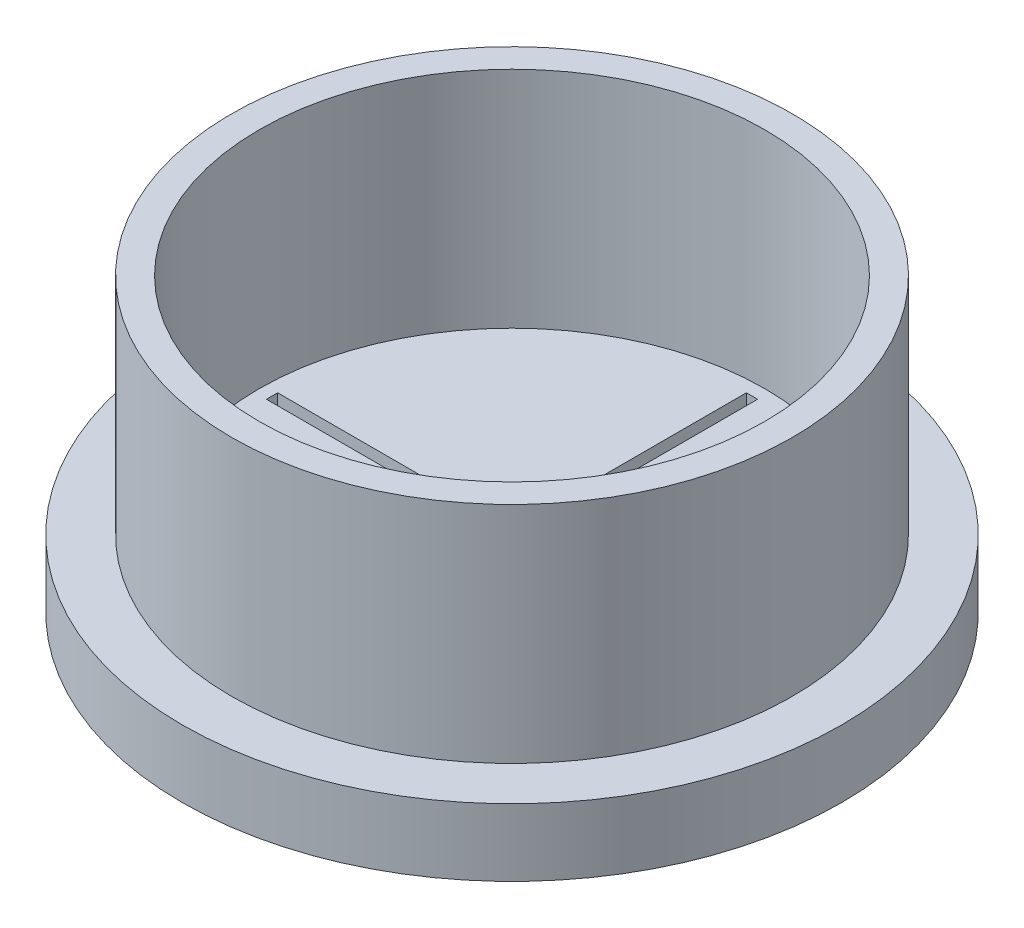
ISO-10303-21;
HEADER;
FILE_DESCRIPTION(('STEP AP214'),'2;1');
FILE_NAME('part.step','',(''),(''),'','','');
FILE_SCHEMA(('AUTOMOTIVE_DESIGN { 1 0 10303 214 1 1 1 1 }'));
ENDSEC;
DATA;
#1=APPLICATION_CONTEXT('core data for automotive mechanical design processes');
#2=APPLICATION_PROTOCOL_DEFINITION('international standard','automotive_design',2000,#1);
#3=PRODUCT_CONTEXT('',#1,'mechanical');
#4=PRODUCT('Part','Part','',(#3));
#5=PRODUCT_RELATED_PRODUCT_CATEGORY('part','',(#4));
#6=PRODUCT_DEFINITION_FORMATION('','',#4);
#7=PRODUCT_DEFINITION_CONTEXT('part definition',#1,'design');
#8=PRODUCT_DEFINITION('design','',#6,#7);
#9=PRODUCT_DEFINITION_SHAPE('','',#8);
#10=(LENGTH_UNIT() NAMED_UNIT(*) SI_UNIT(.MILLI.,.METRE.));
#11=(NAMED_UNIT(*) PLANE_ANGLE_UNIT() SI_UNIT($,.RADIAN.));
#12=(NAMED_UNIT(*) SI_UNIT($,.STERADIAN.) SOLID_ANGLE_UNIT());
#13=UNCERTAINTY_MEASURE_WITH_UNIT(LENGTH_MEASURE(1.E-05),#10,'distance_accuracy_value','');
#14=(GEOMETRIC_REPRESENTATION_CONTEXT(3) GLOBAL_UNCERTAINTY_ASSIGNED_CONTEXT((#13)) GLOBAL_UNIT_ASSIGNED_CONTEXT((#10,
#11,#12)) REPRESENTATION_CONTEXT('',''));
#15=CARTESIAN_POINT('',(0.,0.,0.));
#16=DIRECTION('',(0.,0.,1.));
#17=DIRECTION('',(1.,0.,0.));
#18=AXIS2_PLACEMENT_3D('',#15,#16,#17);
#19=CARTESIAN_POINT('',(-10.7,0.,-0.25));
#20=DIRECTION('',(0.,0.,1.));
#21=DIRECTION('',(1.,0.,0.));
#22=AXIS2_PLACEMENT_3D('',#19,#20,#21);
#23=PLANE('',#22);
#24=DIRECTION('',(0.,1.,0.));
#25=VECTOR('',#24,1.);
#26=CARTESIAN_POINT('',(0.25,0.,-0.25));
#27=LINE('',#26,#25);
#28=CARTESIAN_POINT('',(0.25,0.,-0.25));
#29=VERTEX_POINT('',#28);
#30=CARTESIAN_POINT('',(0.25,3.,-0.25));
#31=VERTEX_POINT('',#30);
#32=EDGE_CURVE('E142',#29,#31,#27,.T.);
#33=ORIENTED_EDGE('',*,*,#32,.F.);
#34=DIRECTION('',(1.,0.,0.));
#35=VECTOR('',#34,1.);
#36=CARTESIAN_POINT('',(-10.7,0.,-0.25));
#37=LINE('',#36,#35);
#38=CARTESIAN_POINT('',(10.7,0.,-0.25));
#39=VERTEX_POINT('',#38);
#40=EDGE_CURVE('E175',#29,#39,#37,.T.);
#41=ORIENTED_EDGE('',*,*,#40,.T.);
#42=DIRECTION('',(0.,1.,0.));
#43=VECTOR('',#42,1.);
#44=CARTESIAN_POINT('',(10.7,0.,-0.25));
#45=LINE('',#44,#43);
#46=CARTESIAN_POINT('',(10.7,3.,-0.25));
#47=VERTEX_POINT('',#46);
#48=EDGE_CURVE('E194',#39,#47,#45,.T.);
#49=ORIENTED_EDGE('',*,*,#48,.T.);
#50=DIRECTION('',(1.,0.,0.));
#51=VECTOR('',#50,1.);
#52=CARTESIAN_POINT('',(-10.7,3.,-0.25));
#53=LINE('',#52,#51);
#54=EDGE_CURVE('E188',#31,#47,#53,.T.);
#55=ORIENTED_EDGE('',*,*,#54,.F.);
#56=EDGE_LOOP('',(#33,#41,#49,#55));
#57=FACE_BOUND('',#56,.T.);
#58=ADVANCED_FACE('F33',(#57),#23,.T.);
#59=CARTESIAN_POINT('',(-10.7,0.,0.25));
#60=DIRECTION('',(0.,0.,1.));
#61=DIRECTION('',(1.,0.,0.));
#62=AXIS2_PLACEMENT_3D('',#59,#60,#61);
#63=PLANE('',#62);
#64=DIRECTION('',(1.,0.,0.));
#65=VECTOR('',#64,1.);
#66=CARTESIAN_POINT('',(-10.7,0.,0.25));
#67=LINE('',#66,#65);
#68=CARTESIAN_POINT('',(0.25,0.,0.25));
#69=VERTEX_POINT('',#68);
#70=CARTESIAN_POINT('',(10.7,0.,0.25));
#71=VERTEX_POINT('',#70);
#72=EDGE_CURVE('E56',#69,#71,#67,.T.);
#73=ORIENTED_EDGE('',*,*,#72,.F.);
#74=DIRECTION('',(0.,1.,0.));
#75=VECTOR('',#74,1.);
#76=CARTESIAN_POINT('',(0.25,0.,0.25));
#77=LINE('',#76,#75);
#78=CARTESIAN_POINT('',(0.250000000000002,3.,0.25));
#79=VERTEX_POINT('',#78);
#80=EDGE_CURVE('E11',#69,#79,#77,.T.);
#81=ORIENTED_EDGE('',*,*,#80,.T.);
#82=DIRECTION('',(1.,0.,0.));
#83=VECTOR('',#82,1.);
#84=CARTESIAN_POINT('',(-10.7,3.,0.25));
#85=LINE('',#84,#83);
#86=CARTESIAN_POINT('',(10.7,3.,0.25));
#87=VERTEX_POINT('',#86);
#88=EDGE_CURVE('E182',#79,#87,#85,.T.);
#89=ORIENTED_EDGE('',*,*,#88,.T.);
#90=DIRECTION('',(0.,1.,0.));
#91=VECTOR('',#90,1.);
#92=CARTESIAN_POINT('',(10.7,0.,0.25));
#93=LINE('',#92,#91);
#94=EDGE_CURVE('E197',#71,#87,#93,.T.);
#95=ORIENTED_EDGE('',*,*,#94,.F.);
#96=EDGE_LOOP('',(#73,#81,#89,#95));
#97=FACE_BOUND('',#96,.T.);
#98=ADVANCED_FACE('F245',(#97),#63,.F.);
#99=CARTESIAN_POINT('',(0.,3.,0.));
#100=DIRECTION('',(0.,-1.,0.));
#101=DIRECTION('',(0.,0.,-1.));
#102=AXIS2_PLACEMENT_3D('',#99,#100,#101);
#103=CYLINDRICAL_SURFACE('',#102,14.7);
#104=CARTESIAN_POINT('',(0.,3.,0.));
#105=DIRECTION('',(0.,1.,0.));
#106=DIRECTION('',(0.,0.,1.));
#107=AXIS2_PLACEMENT_3D('',#104,#105,#106);
#108=CIRCLE('',#107,14.7);
#109=CARTESIAN_POINT('',(0.,3.,14.7));
#110=VERTEX_POINT('',#109);
#111=EDGE_CURVE('E202',#110,#110,#108,.T.);
#112=ORIENTED_EDGE('',*,*,#111,.F.);
#113=EDGE_LOOP('',(#112));
#114=FACE_BOUND('',#113,.T.);
#115=CARTESIAN_POINT('',(0.,0.,0.));
#116=DIRECTION('',(0.,1.,0.));
#117=DIRECTION('',(0.,0.,1.));
#118=AXIS2_PLACEMENT_3D('',#115,#116,#117);
#119=CIRCLE('',#118,14.7);
#120=CARTESIAN_POINT('',(0.,0.,14.7));
#121=VERTEX_POINT('',#120);
#122=EDGE_CURVE('E193',#121,#121,#119,.T.);
#123=ORIENTED_EDGE('',*,*,#122,.T.);
#124=EDGE_LOOP('',(#123));
#125=FACE_BOUND('',#124,.T.);
#126=ADVANCED_FACE('F35',(#114,#125),#103,.T.);
#127=CARTESIAN_POINT('',(0.,3.,0.));
#128=DIRECTION('',(0.,1.,0.));
#129=DIRECTION('',(0.,0.,1.));
#130=AXIS2_PLACEMENT_3D('',#127,#128,#129);
#131=PLANE('',#130);
#132=CARTESIAN_POINT('',(0.,3.,0.));
#133=DIRECTION('',(0.,1.,0.));
#134=DIRECTION('',(0.,0.,1.));
#135=AXIS2_PLACEMENT_3D('',#132,#133,#134);
#136=CIRCLE('',#135,12.5);
#137=CARTESIAN_POINT('',(0.,3.,12.5));
#138=VERTEX_POINT('',#137);
#139=EDGE_CURVE('E277',#138,#138,#136,.T.);
#140=ORIENTED_EDGE('',*,*,#139,.F.);
#141=EDGE_LOOP('',(#140));
#142=FACE_BOUND('',#141,.T.);
#143=ORIENTED_EDGE('',*,*,#111,.T.);
#144=EDGE_LOOP('',(#143));
#145=FACE_BOUND('',#144,.T.);
#146=ADVANCED_FACE('F308',(#142,#145),#131,.T.);
#147=CARTESIAN_POINT('',(0.,0.,0.));
#148=DIRECTION('',(0.,1.,0.));
#149=DIRECTION('',(0.,0.,1.));
#150=AXIS2_PLACEMENT_3D('',#147,#148,#149);
#151=PLANE('',#150);
#152=DIRECTION('',(1.,0.,0.));
#153=VECTOR('',#152,1.);
#154=CARTESIAN_POINT('',(-0.249999999999999,0.,10.7));
#155=LINE('',#154,#153);
#156=CARTESIAN_POINT('',(-0.249999999999999,0.,10.7));
#157=VERTEX_POINT('',#156);
#158=CARTESIAN_POINT('',(0.250000000000001,0.,10.7));
#159=VERTEX_POINT('',#158);
#160=EDGE_CURVE('E151',#157,#159,#155,.T.);
#161=ORIENTED_EDGE('',*,*,#160,.T.);
#162=DIRECTION('',(0.,0.,-1.));
#163=VECTOR('',#162,1.);
#164=CARTESIAN_POINT('',(0.249999999999999,0.,-10.7));
#165=LINE('',#164,#163);
#166=EDGE_CURVE('E275',#159,#69,#165,.T.);
#167=ORIENTED_EDGE('',*,*,#166,.T.);
#168=ORIENTED_EDGE('',*,*,#72,.T.);
#169=DIRECTION('',(0.,0.,1.));
#170=VECTOR('',#169,1.);
#171=CARTESIAN_POINT('',(10.7,0.,-0.25));
#172=LINE('',#171,#170);
#173=EDGE_CURVE('E172',#39,#71,#172,.T.);
#174=ORIENTED_EDGE('',*,*,#173,.F.);
#175=ORIENTED_EDGE('',*,*,#40,.F.);
#176=CARTESIAN_POINT('',(0.249999999999999,0.,-10.7));
#177=VERTEX_POINT('',#176);
#178=EDGE_CURVE('E224',#29,#177,#165,.T.);
#179=ORIENTED_EDGE('',*,*,#178,.T.);
#180=DIRECTION('',(-1.,0.,0.));
#181=VECTOR('',#180,1.);
#182=CARTESIAN_POINT('',(-0.250000000000001,0.,-10.7));
#183=LINE('',#182,#181);
#184=CARTESIAN_POINT('',(-0.250000000000001,0.,-10.7));
#185=VERTEX_POINT('',#184);
#186=EDGE_CURVE('E148',#177,#185,#183,.T.);
#187=ORIENTED_EDGE('',*,*,#186,.T.);
#188=DIRECTION('',(0.,0.,1.));
#189=VECTOR('',#188,1.);
#190=CARTESIAN_POINT('',(-0.250000000000001,0.,-10.7));
#191=LINE('',#190,#189);
#192=CARTESIAN_POINT('',(-0.25,0.,-0.25));
#193=VERTEX_POINT('',#192);
#194=EDGE_CURVE('E156',#185,#193,#191,.T.);
#195=ORIENTED_EDGE('',*,*,#194,.T.);
#196=CARTESIAN_POINT('',(-10.7,0.,-0.25));
#197=VERTEX_POINT('',#196);
#198=EDGE_CURVE('E176',#197,#193,#37,.T.);
#199=ORIENTED_EDGE('',*,*,#198,.F.);
#200=DIRECTION('',(0.,0.,1.));
#201=VECTOR('',#200,1.);
#202=CARTESIAN_POINT('',(-10.7,0.,-0.25));
#203=LINE('',#202,#201);
#204=CARTESIAN_POINT('',(-10.7,0.,0.25));
#205=VERTEX_POINT('',#204);
#206=EDGE_CURVE('E165',#197,#205,#203,.T.);
#207=ORIENTED_EDGE('',*,*,#206,.T.);
#208=CARTESIAN_POINT('',(-0.250000000000002,0.,0.25));
#209=VERTEX_POINT('',#208);
#210=EDGE_CURVE('E169',#205,#209,#67,.T.);
#211=ORIENTED_EDGE('',*,*,#210,.T.);
#212=EDGE_CURVE('E48',#209,#157,#191,.T.);
#213=ORIENTED_EDGE('',*,*,#212,.T.);
#214=EDGE_LOOP('',(#161,#167,#168,#174,#175,#179,#187,#195,#199,#207,#211,#213));
#215=FACE_BOUND('',#214,.T.);
#216=ORIENTED_EDGE('',*,*,#122,.F.);
#217=EDGE_LOOP('',(#216));
#218=FACE_BOUND('',#217,.T.);
#219=ADVANCED_FACE('F210',(#215,#218),#151,.F.);
#220=CARTESIAN_POINT('',(-10.7,0.,-0.25));
#221=DIRECTION('',(-1.,0.,0.));
#222=DIRECTION('',(0.,0.,1.));
#223=AXIS2_PLACEMENT_3D('',#220,#221,#222);
#224=PLANE('',#223);
#225=DIRECTION('',(0.,0.,1.));
#226=VECTOR('',#225,1.);
#227=CARTESIAN_POINT('',(-10.7,3.,-0.25));
#228=LINE('',#227,#226);
#229=CARTESIAN_POINT('',(-10.7,3.,-0.25));
#230=VERTEX_POINT('',#229);
#231=CARTESIAN_POINT('',(-10.7,3.,0.25));
#232=VERTEX_POINT('',#231);
#233=EDGE_CURVE('E164',#230,#232,#228,.T.);
#234=ORIENTED_EDGE('',*,*,#233,.T.);
#235=DIRECTION('',(0.,1.,0.));
#236=VECTOR('',#235,1.);
#237=CARTESIAN_POINT('',(-10.7,0.,0.25));
#238=LINE('',#237,#236);
#239=EDGE_CURVE('E179',#205,#232,#238,.T.);
#240=ORIENTED_EDGE('',*,*,#239,.F.);
#241=ORIENTED_EDGE('',*,*,#206,.F.);
#242=DIRECTION('',(0.,1.,0.));
#243=VECTOR('',#242,1.);
#244=CARTESIAN_POINT('',(-10.7,0.,-0.25));
#245=LINE('',#244,#243);
#246=EDGE_CURVE('E190',#197,#230,#245,.T.);
#247=ORIENTED_EDGE('',*,*,#246,.T.);
#248=EDGE_LOOP('',(#234,#240,#241,#247));
#249=FACE_BOUND('',#248,.T.);
#250=ADVANCED_FACE('F216',(#249),#224,.F.);
#251=DIRECTION('',(0.,-1.,0.));
#252=VECTOR('',#251,1.);
#253=CARTESIAN_POINT('',(-0.25,0.,-0.25));
#254=LINE('',#253,#252);
#255=CARTESIAN_POINT('',(-0.25,3.,-0.25));
#256=VERTEX_POINT('',#255);
#257=EDGE_CURVE('E160',#256,#193,#254,.T.);
#258=ORIENTED_EDGE('',*,*,#257,.F.);
#259=EDGE_CURVE('E168',#230,#256,#53,.T.);
#260=ORIENTED_EDGE('',*,*,#259,.F.);
#261=ORIENTED_EDGE('',*,*,#246,.F.);
#262=ORIENTED_EDGE('',*,*,#198,.T.);
#263=EDGE_LOOP('',(#258,#260,#261,#262));
#264=FACE_BOUND('',#263,.T.);
#265=ADVANCED_FACE('F248',(#264),#23,.T.);
#266=CARTESIAN_POINT('',(10.7,0.,-0.25));
#267=DIRECTION('',(-1.,0.,0.));
#268=DIRECTION('',(0.,0.,1.));
#269=AXIS2_PLACEMENT_3D('',#266,#267,#268);
#270=PLANE('',#269);
#271=DIRECTION('',(0.,0.,1.));
#272=VECTOR('',#271,1.);
#273=CARTESIAN_POINT('',(10.7,3.,-0.25));
#274=LINE('',#273,#272);
#275=EDGE_CURVE('E186',#47,#87,#274,.T.);
#276=ORIENTED_EDGE('',*,*,#275,.F.);
#277=ORIENTED_EDGE('',*,*,#48,.F.);
#278=ORIENTED_EDGE('',*,*,#173,.T.);
#279=ORIENTED_EDGE('',*,*,#94,.T.);
#280=EDGE_LOOP('',(#276,#277,#278,#279));
#281=FACE_BOUND('',#280,.T.);
#282=ADVANCED_FACE('F256',(#281),#270,.T.);
#283=CARTESIAN_POINT('',(-0.250000000000002,3.,0.25));
#284=VERTEX_POINT('',#283);
#285=EDGE_CURVE('E183',#232,#284,#85,.T.);
#286=ORIENTED_EDGE('',*,*,#285,.T.);
#287=DIRECTION('',(0.,-1.,0.));
#288=VECTOR('',#287,1.);
#289=CARTESIAN_POINT('',(-0.25,0.,0.25));
#290=LINE('',#289,#288);
#291=EDGE_CURVE('E41',#284,#209,#290,.T.);
#292=ORIENTED_EDGE('',*,*,#291,.T.);
#293=ORIENTED_EDGE('',*,*,#210,.F.);
#294=ORIENTED_EDGE('',*,*,#239,.T.);
#295=EDGE_LOOP('',(#286,#292,#293,#294));
#296=FACE_BOUND('',#295,.T.);
#297=ADVANCED_FACE('F208',(#296),#63,.F.);
#298=CARTESIAN_POINT('',(0.249999999999999,0.,-10.7));
#299=DIRECTION('',(1.,0.,0.));
#300=DIRECTION('',(0.,0.,-1.));
#301=AXIS2_PLACEMENT_3D('',#298,#299,#300);
#302=PLANE('',#301);
#303=ORIENTED_EDGE('',*,*,#166,.F.);
#304=DIRECTION('',(0.,1.,0.));
#305=VECTOR('',#304,1.);
#306=CARTESIAN_POINT('',(0.250000000000001,0.,10.7));
#307=LINE('',#306,#305);
#308=CARTESIAN_POINT('',(0.250000000000001,3.,10.7));
#309=VERTEX_POINT('',#308);
#310=EDGE_CURVE('E162',#159,#309,#307,.T.);
#311=ORIENTED_EDGE('',*,*,#310,.T.);
#312=DIRECTION('',(0.,0.,-1.));
#313=VECTOR('',#312,1.);
#314=CARTESIAN_POINT('',(0.249999999999999,3.,-10.7));
#315=LINE('',#314,#313);
#316=EDGE_CURVE('E135',#309,#79,#315,.T.);
#317=ORIENTED_EDGE('',*,*,#316,.T.);
#318=ORIENTED_EDGE('',*,*,#80,.F.);
#319=EDGE_LOOP('',(#303,#311,#317,#318));
#320=FACE_BOUND('',#319,.T.);
#321=ADVANCED_FACE('F231',(#320),#302,.F.);
#322=CARTESIAN_POINT('',(-0.250000000000001,0.,-10.7));
#323=DIRECTION('',(-1.,0.,0.));
#324=DIRECTION('',(0.,0.,1.));
#325=AXIS2_PLACEMENT_3D('',#322,#323,#324);
#326=PLANE('',#325);
#327=DIRECTION('',(0.,0.,1.));
#328=VECTOR('',#327,1.);
#329=CARTESIAN_POINT('',(-0.250000000000001,3.,-10.7));
#330=LINE('',#329,#328);
#331=CARTESIAN_POINT('',(-0.249999999999999,3.,10.7));
#332=VERTEX_POINT('',#331);
#333=EDGE_CURVE('E134',#284,#332,#330,.T.);
#334=ORIENTED_EDGE('',*,*,#333,.T.);
#335=DIRECTION('',(0.,1.,0.));
#336=VECTOR('',#335,1.);
#337=CARTESIAN_POINT('',(-0.249999999999999,0.,10.7));
#338=LINE('',#337,#336);
#339=EDGE_CURVE('E153',#157,#332,#338,.T.);
#340=ORIENTED_EDGE('',*,*,#339,.F.);
#341=ORIENTED_EDGE('',*,*,#212,.F.);
#342=ORIENTED_EDGE('',*,*,#291,.F.);
#343=EDGE_LOOP('',(#334,#340,#341,#342));
#344=FACE_BOUND('',#343,.T.);
#345=ADVANCED_FACE('F229',(#344),#326,.F.);
#346=CARTESIAN_POINT('',(-0.249999999999999,0.,10.7));
#347=DIRECTION('',(0.,0.,1.));
#348=DIRECTION('',(1.,0.,0.));
#349=AXIS2_PLACEMENT_3D('',#346,#347,#348);
#350=PLANE('',#349);
#351=DIRECTION('',(1.,0.,0.));
#352=VECTOR('',#351,1.);
#353=CARTESIAN_POINT('',(-0.249999999999999,3.,10.7));
#354=LINE('',#353,#352);
#355=EDGE_CURVE('E219',#332,#309,#354,.T.);
#356=ORIENTED_EDGE('',*,*,#355,.T.);
#357=ORIENTED_EDGE('',*,*,#310,.F.);
#358=ORIENTED_EDGE('',*,*,#160,.F.);
#359=ORIENTED_EDGE('',*,*,#339,.T.);
#360=EDGE_LOOP('',(#356,#357,#358,#359));
#361=FACE_BOUND('',#360,.T.);
#362=ADVANCED_FACE('F228',(#361),#350,.F.);
#363=ORIENTED_EDGE('',*,*,#32,.T.);
#364=CARTESIAN_POINT('',(0.249999999999999,3.,-10.7));
#365=VERTEX_POINT('',#364);
#366=EDGE_CURVE('E127',#31,#365,#315,.T.);
#367=ORIENTED_EDGE('',*,*,#366,.T.);
#368=DIRECTION('',(0.,1.,0.));
#369=VECTOR('',#368,1.);
#370=CARTESIAN_POINT('',(0.249999999999999,0.,-10.7));
#371=LINE('',#370,#369);
#372=EDGE_CURVE('E139',#177,#365,#371,.T.);
#373=ORIENTED_EDGE('',*,*,#372,.F.);
#374=ORIENTED_EDGE('',*,*,#178,.F.);
#375=EDGE_LOOP('',(#363,#367,#373,#374));
#376=FACE_BOUND('',#375,.T.);
#377=ADVANCED_FACE('F138',(#376),#302,.F.);
#378=ORIENTED_EDGE('',*,*,#257,.T.);
#379=ORIENTED_EDGE('',*,*,#194,.F.);
#380=DIRECTION('',(0.,1.,0.));
#381=VECTOR('',#380,1.);
#382=CARTESIAN_POINT('',(-0.250000000000001,0.,-10.7));
#383=LINE('',#382,#381);
#384=CARTESIAN_POINT('',(-0.250000000000001,3.,-10.7));
#385=VERTEX_POINT('',#384);
#386=EDGE_CURVE('E150',#185,#385,#383,.T.);
#387=ORIENTED_EDGE('',*,*,#386,.T.);
#388=EDGE_CURVE('E130',#385,#256,#330,.T.);
#389=ORIENTED_EDGE('',*,*,#388,.T.);
#390=EDGE_LOOP('',(#378,#379,#387,#389));
#391=FACE_BOUND('',#390,.T.);
#392=ADVANCED_FACE('F233',(#391),#326,.F.);
#393=CARTESIAN_POINT('',(-0.250000000000001,0.,-10.7));
#394=DIRECTION('',(0.,0.,-1.));
#395=DIRECTION('',(-1.,0.,0.));
#396=AXIS2_PLACEMENT_3D('',#393,#394,#395);
#397=PLANE('',#396);
#398=DIRECTION('',(-1.,0.,0.));
#399=VECTOR('',#398,1.);
#400=CARTESIAN_POINT('',(-0.250000000000001,3.,-10.7));
#401=LINE('',#400,#399);
#402=EDGE_CURVE('E124',#365,#385,#401,.T.);
#403=ORIENTED_EDGE('',*,*,#402,.T.);
#404=ORIENTED_EDGE('',*,*,#386,.F.);
#405=ORIENTED_EDGE('',*,*,#186,.F.);
#406=ORIENTED_EDGE('',*,*,#372,.T.);
#407=EDGE_LOOP('',(#403,#404,#405,#406));
#408=FACE_BOUND('',#407,.T.);
#409=ADVANCED_FACE('F146',(#408),#397,.F.);
#410=CARTESIAN_POINT('',(0.,13.,0.));
#411=DIRECTION('',(0.,-1.,0.));
#412=DIRECTION('',(0.,0.,-1.));
#413=AXIS2_PLACEMENT_3D('',#410,#411,#412);
#414=CYLINDRICAL_SURFACE('',#413,12.5);
#415=CARTESIAN_POINT('',(0.,13.,0.));
#416=DIRECTION('',(0.,1.,0.));
#417=DIRECTION('',(0.,0.,1.));
#418=AXIS2_PLACEMENT_3D('',#415,#416,#417);
#419=CIRCLE('',#418,12.5);
#420=CARTESIAN_POINT('',(0.,13.,12.5));
#421=VERTEX_POINT('',#420);
#422=EDGE_CURVE('E144',#421,#421,#419,.T.);
#423=ORIENTED_EDGE('',*,*,#422,.F.);
#424=EDGE_LOOP('',(#423));
#425=FACE_BOUND('',#424,.T.);
#426=ORIENTED_EDGE('',*,*,#139,.T.);
#427=EDGE_LOOP('',(#426));
#428=FACE_BOUND('',#427,.T.);
#429=ADVANCED_FACE('F299',(#425,#428),#414,.T.);
#430=CARTESIAN_POINT('',(0.,13.,0.));
#431=DIRECTION('',(0.,1.,0.));
#432=DIRECTION('',(0.,0.,1.));
#433=AXIS2_PLACEMENT_3D('',#430,#431,#432);
#434=PLANE('',#433);
#435=CARTESIAN_POINT('',(0.,13.,0.));
#436=DIRECTION('',(0.,1.,0.));
#437=DIRECTION('',(0.,0.,1.));
#438=AXIS2_PLACEMENT_3D('',#435,#436,#437);
#439=CIRCLE('',#438,11.27);
#440=CARTESIAN_POINT('',(0.,13.,11.27));
#441=VERTEX_POINT('',#440);
#442=EDGE_CURVE('E283',#441,#441,#439,.T.);
#443=ORIENTED_EDGE('',*,*,#442,.F.);
#444=EDGE_LOOP('',(#443));
#445=FACE_BOUND('',#444,.T.);
#446=ORIENTED_EDGE('',*,*,#422,.T.);
#447=EDGE_LOOP('',(#446));
#448=FACE_BOUND('',#447,.T.);
#449=ADVANCED_FACE('F296',(#445,#448),#434,.T.);
#450=CARTESIAN_POINT('',(0.,3.,0.));
#451=DIRECTION('',(0.,1.,0.));
#452=DIRECTION('',(0.,0.,1.));
#453=AXIS2_PLACEMENT_3D('',#450,#451,#452);
#454=PLANE('',#453);
#455=CARTESIAN_POINT('',(0.,3.,0.));
#456=DIRECTION('',(0.,1.,0.));
#457=DIRECTION('',(0.,0.,1.));
#458=AXIS2_PLACEMENT_3D('',#455,#456,#457);
#459=CIRCLE('',#458,11.27);
#460=CARTESIAN_POINT('',(0.,3.,11.27));
#461=VERTEX_POINT('',#460);
#462=EDGE_CURVE('E280',#461,#461,#459,.T.);
#463=ORIENTED_EDGE('',*,*,#462,.T.);
#464=EDGE_LOOP('',(#463));
#465=FACE_BOUND('',#464,.T.);
#466=ORIENTED_EDGE('',*,*,#355,.F.);
#467=ORIENTED_EDGE('',*,*,#333,.F.);
#468=ORIENTED_EDGE('',*,*,#285,.F.);
#469=ORIENTED_EDGE('',*,*,#233,.F.);
#470=ORIENTED_EDGE('',*,*,#259,.T.);
#471=ORIENTED_EDGE('',*,*,#388,.F.);
#472=ORIENTED_EDGE('',*,*,#402,.F.);
#473=ORIENTED_EDGE('',*,*,#366,.F.);
#474=ORIENTED_EDGE('',*,*,#54,.T.);
#475=ORIENTED_EDGE('',*,*,#275,.T.);
#476=ORIENTED_EDGE('',*,*,#88,.F.);
#477=ORIENTED_EDGE('',*,*,#316,.F.);
#478=EDGE_LOOP('',(#466,#467,#468,#469,#470,#471,#472,#473,#474,#475,#476,#477));
#479=FACE_BOUND('',#478,.T.);
#480=ADVANCED_FACE('F126',(#465,#479),#454,.T.);
#481=CARTESIAN_POINT('',(0.,3.,0.));
#482=DIRECTION('',(0.,1.,0.));
#483=DIRECTION('',(0.,0.,1.));
#484=AXIS2_PLACEMENT_3D('',#481,#482,#483);
#485=CYLINDRICAL_SURFACE('',#484,11.27);
#486=ORIENTED_EDGE('',*,*,#462,.F.);
#487=EDGE_LOOP('',(#486));
#488=FACE_BOUND('',#487,.T.);
#489=ORIENTED_EDGE('',*,*,#442,.T.);
#490=EDGE_LOOP('',(#489));
#491=FACE_BOUND('',#490,.T.);
#492=ADVANCED_FACE('F290',(#488,#491),#485,.F.);
#493=CLOSED_SHELL('',(#58,#98,#126,#146,#219,#250,#265,#282,#297,#321,#345,#362,#377,#392,#409,
#429,#449,#480,#492));
#494=MANIFOLD_SOLID_BREP('B2',#493);
#495=ADVANCED_BREP_SHAPE_REPRESENTATION('',(#18,#494),#14);
#496=SHAPE_DEFINITION_REPRESENTATION(#9,#495);
ENDSEC;
END-ISO-10303-21;
